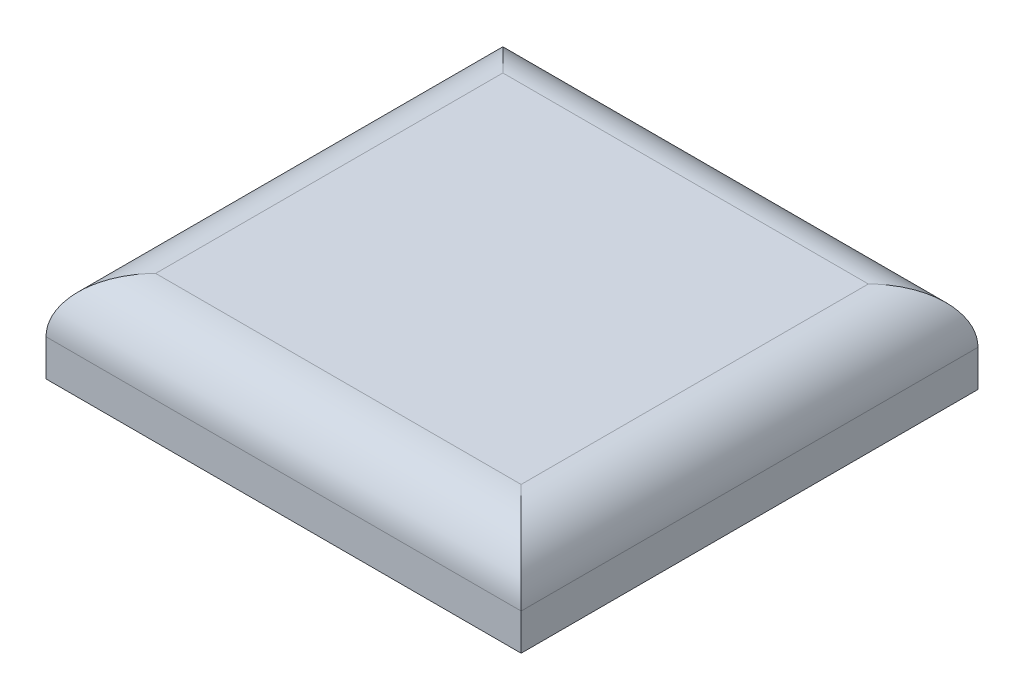
ISO-10303-21;
HEADER;
FILE_DESCRIPTION(('STEP AP214'),'2;1');
FILE_NAME('part.step','',(''),(''),'','','');
FILE_SCHEMA(('AUTOMOTIVE_DESIGN { 1 0 10303 214 1 1 1 1 }'));
ENDSEC;
DATA;
#1=APPLICATION_CONTEXT('core data for automotive mechanical design processes');
#2=APPLICATION_PROTOCOL_DEFINITION('international standard','automotive_design',2000,#1);
#3=PRODUCT_CONTEXT('',#1,'mechanical');
#4=PRODUCT('Part','Part','',(#3));
#5=PRODUCT_RELATED_PRODUCT_CATEGORY('part','',(#4));
#6=PRODUCT_DEFINITION_FORMATION('','',#4);
#7=PRODUCT_DEFINITION_CONTEXT('part definition',#1,'design');
#8=PRODUCT_DEFINITION('design','',#6,#7);
#9=PRODUCT_DEFINITION_SHAPE('','',#8);
#10=(LENGTH_UNIT() NAMED_UNIT(*) SI_UNIT(.MILLI.,.METRE.));
#11=(NAMED_UNIT(*) PLANE_ANGLE_UNIT() SI_UNIT($,.RADIAN.));
#12=(NAMED_UNIT(*) SI_UNIT($,.STERADIAN.) SOLID_ANGLE_UNIT());
#13=UNCERTAINTY_MEASURE_WITH_UNIT(LENGTH_MEASURE(1.E-05),#10,'distance_accuracy_value','');
#14=(GEOMETRIC_REPRESENTATION_CONTEXT(3) GLOBAL_UNCERTAINTY_ASSIGNED_CONTEXT((#13)) GLOBAL_UNIT_ASSIGNED_CONTEXT((#10,
#11,#12)) REPRESENTATION_CONTEXT('',''));
#15=CARTESIAN_POINT('',(0.,0.,0.));
#16=DIRECTION('',(0.,0.,1.));
#17=DIRECTION('',(1.,0.,0.));
#18=AXIS2_PLACEMENT_3D('',#15,#16,#17);
#19=CARTESIAN_POINT('',(766.873880354263,267.2,-662.343378516994));
#20=DIRECTION('',(0.,0.,1.));
#21=DIRECTION('',(1.,0.,0.));
#22=AXIS2_PLACEMENT_3D('',#19,#20,#21);
#23=PLANE('',#22);
#24=DIRECTION('',(0.,-1.,0.));
#25=VECTOR('',#24,1.);
#26=CARTESIAN_POINT('',(-533.126119645738,267.2,-662.343378516994));
#27=LINE('',#26,#25);
#28=CARTESIAN_POINT('',(-533.126119645738,117.2,-662.343378516994));
#29=VERTEX_POINT('',#28);
#30=CARTESIAN_POINT('',(-533.126119645738,17.2,-662.343378516994));
#31=VERTEX_POINT('',#30);
#32=EDGE_CURVE('E201',#29,#31,#27,.T.);
#33=ORIENTED_EDGE('',*,*,#32,.F.);
#34=DIRECTION('',(-1.,0.,0.));
#35=VECTOR('',#34,1.);
#36=CARTESIAN_POINT('',(766.873880354263,117.2,-662.343378516994));
#37=LINE('',#36,#35);
#38=CARTESIAN_POINT('',(766.873880354263,117.2,-662.343378516994));
#39=VERTEX_POINT('',#38);
#40=EDGE_CURVE('E11',#29,#39,#37,.F.);
#41=ORIENTED_EDGE('',*,*,#40,.T.);
#42=DIRECTION('',(0.,-1.,0.));
#43=VECTOR('',#42,1.);
#44=CARTESIAN_POINT('',(766.873880354263,267.2,-662.343378516994));
#45=LINE('',#44,#43);
#46=CARTESIAN_POINT('',(766.873880354263,17.2,-662.343378516994));
#47=VERTEX_POINT('',#46);
#48=EDGE_CURVE('E195',#39,#47,#45,.T.);
#49=ORIENTED_EDGE('',*,*,#48,.T.);
#50=DIRECTION('',(-1.,0.,0.));
#51=VECTOR('',#50,1.);
#52=CARTESIAN_POINT('',(766.873880354263,17.2,-662.343378516994));
#53=LINE('',#52,#51);
#54=EDGE_CURVE('E183',#47,#31,#53,.T.);
#55=ORIENTED_EDGE('',*,*,#54,.T.);
#56=EDGE_LOOP('',(#33,#41,#49,#55));
#57=FACE_BOUND('',#56,.T.);
#58=ADVANCED_FACE('F43',(#57),#23,.F.);
#59=CARTESIAN_POINT('',(-533.126119645738,267.2,-662.343378516994));
#60=DIRECTION('',(1.,0.,0.));
#61=DIRECTION('',(0.,0.,-1.));
#62=AXIS2_PLACEMENT_3D('',#59,#60,#61);
#63=PLANE('',#62);
#64=DIRECTION('',(0.,-1.,0.));
#65=VECTOR('',#64,1.);
#66=CARTESIAN_POINT('',(-533.126119645738,267.2,587.656621483006));
#67=LINE('',#66,#65);
#68=CARTESIAN_POINT('',(-533.126119645738,117.2,587.656621483006));
#69=VERTEX_POINT('',#68);
#70=CARTESIAN_POINT('',(-533.126119645738,17.2,587.656621483006));
#71=VERTEX_POINT('',#70);
#72=EDGE_CURVE('E199',#69,#71,#67,.T.);
#73=ORIENTED_EDGE('',*,*,#72,.F.);
#74=DIRECTION('',(0.,0.,1.));
#75=VECTOR('',#74,1.);
#76=CARTESIAN_POINT('',(-533.126119645738,117.2,-662.343378516994));
#77=LINE('',#76,#75);
#78=EDGE_CURVE('E52',#69,#29,#77,.F.);
#79=ORIENTED_EDGE('',*,*,#78,.T.);
#80=ORIENTED_EDGE('',*,*,#32,.T.);
#81=DIRECTION('',(0.,0.,1.));
#82=VECTOR('',#81,1.);
#83=CARTESIAN_POINT('',(-533.126119645738,17.2,-662.343378516994));
#84=LINE('',#83,#82);
#85=EDGE_CURVE('E186',#31,#71,#84,.T.);
#86=ORIENTED_EDGE('',*,*,#85,.T.);
#87=EDGE_LOOP('',(#73,#79,#80,#86));
#88=FACE_BOUND('',#87,.T.);
#89=ADVANCED_FACE('F263',(#88),#63,.F.);
#90=CARTESIAN_POINT('',(-533.126119645738,267.2,587.656621483006));
#91=DIRECTION('',(0.,0.,-1.));
#92=DIRECTION('',(-1.,0.,0.));
#93=AXIS2_PLACEMENT_3D('',#90,#91,#92);
#94=PLANE('',#93);
#95=DIRECTION('',(0.,-1.,0.));
#96=VECTOR('',#95,1.);
#97=CARTESIAN_POINT('',(766.873880354262,267.2,587.656621483006));
#98=LINE('',#97,#96);
#99=CARTESIAN_POINT('',(766.873880354262,117.2,587.656621483006));
#100=VERTEX_POINT('',#99);
#101=CARTESIAN_POINT('',(766.873880354262,17.2,587.656621483006));
#102=VERTEX_POINT('',#101);
#103=EDGE_CURVE('E197',#100,#102,#98,.T.);
#104=ORIENTED_EDGE('',*,*,#103,.F.);
#105=DIRECTION('',(1.,0.,0.));
#106=VECTOR('',#105,1.);
#107=CARTESIAN_POINT('',(-533.126119645738,117.2,587.656621483006));
#108=LINE('',#107,#106);
#109=EDGE_CURVE('E215',#100,#69,#108,.F.);
#110=ORIENTED_EDGE('',*,*,#109,.T.);
#111=ORIENTED_EDGE('',*,*,#72,.T.);
#112=DIRECTION('',(1.,0.,0.));
#113=VECTOR('',#112,1.);
#114=CARTESIAN_POINT('',(-533.126119645738,17.2,587.656621483006));
#115=LINE('',#114,#113);
#116=EDGE_CURVE('E189',#71,#102,#115,.T.);
#117=ORIENTED_EDGE('',*,*,#116,.T.);
#118=EDGE_LOOP('',(#104,#110,#111,#117));
#119=FACE_BOUND('',#118,.T.);
#120=ADVANCED_FACE('F259',(#119),#94,.F.);
#121=CARTESIAN_POINT('',(766.873880354262,267.2,587.656621483006));
#122=DIRECTION('',(-1.,0.,0.));
#123=DIRECTION('',(0.,0.,1.));
#124=AXIS2_PLACEMENT_3D('',#121,#122,#123);
#125=PLANE('',#124);
#126=ORIENTED_EDGE('',*,*,#48,.F.);
#127=DIRECTION('',(0.,0.,-1.));
#128=VECTOR('',#127,1.);
#129=CARTESIAN_POINT('',(766.873880354262,117.2,587.656621483006));
#130=LINE('',#129,#128);
#131=EDGE_CURVE('E212',#39,#100,#130,.F.);
#132=ORIENTED_EDGE('',*,*,#131,.T.);
#133=ORIENTED_EDGE('',*,*,#103,.T.);
#134=DIRECTION('',(0.,0.,-1.));
#135=VECTOR('',#134,1.);
#136=CARTESIAN_POINT('',(766.873880354262,17.2,587.656621483006));
#137=LINE('',#136,#135);
#138=EDGE_CURVE('E192',#102,#47,#137,.T.);
#139=ORIENTED_EDGE('',*,*,#138,.T.);
#140=EDGE_LOOP('',(#126,#132,#133,#139));
#141=FACE_BOUND('',#140,.T.);
#142=ADVANCED_FACE('F241',(#141),#125,.F.);
#143=CARTESIAN_POINT('',(0.,267.2,0.));
#144=DIRECTION('',(0.,1.,0.));
#145=DIRECTION('',(0.,0.,1.));
#146=AXIS2_PLACEMENT_3D('',#143,#144,#145);
#147=PLANE('',#146);
#148=DIRECTION('',(1.,0.,0.));
#149=VECTOR('',#148,1.);
#150=CARTESIAN_POINT('',(766.873880354262,267.2,437.656621483006));
#151=LINE('',#150,#149);
#152=CARTESIAN_POINT('',(-383.126119645738,267.2,437.656621483006));
#153=VERTEX_POINT('',#152);
#154=CARTESIAN_POINT('',(616.873880354262,267.2,437.656621483006));
#155=VERTEX_POINT('',#154);
#156=EDGE_CURVE('E207',#153,#155,#151,.T.);
#157=ORIENTED_EDGE('',*,*,#156,.T.);
#158=DIRECTION('',(0.,0.,-1.));
#159=VECTOR('',#158,1.);
#160=CARTESIAN_POINT('',(616.873880354263,267.2,-662.343378516994));
#161=LINE('',#160,#159);
#162=CARTESIAN_POINT('',(616.873880354263,267.2,-512.343378516994));
#163=VERTEX_POINT('',#162);
#164=EDGE_CURVE('E209',#155,#163,#161,.T.);
#165=ORIENTED_EDGE('',*,*,#164,.T.);
#166=DIRECTION('',(-1.,0.,0.));
#167=VECTOR('',#166,1.);
#168=CARTESIAN_POINT('',(-533.126119645738,267.2,-512.343378516994));
#169=LINE('',#168,#167);
#170=CARTESIAN_POINT('',(-383.126119645738,267.2,-512.343378516994));
#171=VERTEX_POINT('',#170);
#172=EDGE_CURVE('E203',#163,#171,#169,.T.);
#173=ORIENTED_EDGE('',*,*,#172,.T.);
#174=DIRECTION('',(0.,0.,1.));
#175=VECTOR('',#174,1.);
#176=CARTESIAN_POINT('',(-383.126119645738,267.2,587.656621483006));
#177=LINE('',#176,#175);
#178=EDGE_CURVE('E205',#171,#153,#177,.T.);
#179=ORIENTED_EDGE('',*,*,#178,.T.);
#180=EDGE_LOOP('',(#157,#165,#173,#179));
#181=FACE_BOUND('',#180,.T.);
#182=ADVANCED_FACE('F249',(#181),#147,.T.);
#183=CARTESIAN_POINT('',(0.,17.2,0.));
#184=DIRECTION('',(0.,1.,0.));
#185=DIRECTION('',(0.,0.,1.));
#186=AXIS2_PLACEMENT_3D('',#183,#184,#185);
#187=PLANE('',#186);
#188=DIRECTION('',(0.,0.,-1.));
#189=VECTOR('',#188,1.);
#190=CARTESIAN_POINT('',(756.873880354262,17.2,587.656621483006));
#191=LINE('',#190,#189);
#192=CARTESIAN_POINT('',(756.873880354262,17.2,577.656621483006));
#193=VERTEX_POINT('',#192);
#194=CARTESIAN_POINT('',(756.873880354263,17.2,-652.343378516994));
#195=VERTEX_POINT('',#194);
#196=EDGE_CURVE('E156',#193,#195,#191,.T.);
#197=ORIENTED_EDGE('',*,*,#196,.T.);
#198=DIRECTION('',(-1.,0.,0.));
#199=VECTOR('',#198,1.);
#200=CARTESIAN_POINT('',(766.873880354263,17.2,-652.343378516994));
#201=LINE('',#200,#199);
#202=CARTESIAN_POINT('',(-523.126119645738,17.2,-652.343378516994));
#203=VERTEX_POINT('',#202);
#204=EDGE_CURVE('E151',#195,#203,#201,.T.);
#205=ORIENTED_EDGE('',*,*,#204,.T.);
#206=DIRECTION('',(0.,0.,1.));
#207=VECTOR('',#206,1.);
#208=CARTESIAN_POINT('',(-523.126119645738,17.2,-662.343378516994));
#209=LINE('',#208,#207);
#210=CARTESIAN_POINT('',(-523.126119645738,17.2,577.656621483006));
#211=VERTEX_POINT('',#210);
#212=EDGE_CURVE('E177',#203,#211,#209,.T.);
#213=ORIENTED_EDGE('',*,*,#212,.T.);
#214=DIRECTION('',(1.,0.,0.));
#215=VECTOR('',#214,1.);
#216=CARTESIAN_POINT('',(-533.126119645738,17.2,577.656621483006));
#217=LINE('',#216,#215);
#218=EDGE_CURVE('E60',#211,#193,#217,.T.);
#219=ORIENTED_EDGE('',*,*,#218,.T.);
#220=EDGE_LOOP('',(#197,#205,#213,#219));
#221=FACE_BOUND('',#220,.T.);
#222=ORIENTED_EDGE('',*,*,#54,.F.);
#223=ORIENTED_EDGE('',*,*,#138,.F.);
#224=ORIENTED_EDGE('',*,*,#116,.F.);
#225=ORIENTED_EDGE('',*,*,#85,.F.);
#226=EDGE_LOOP('',(#222,#223,#224,#225));
#227=FACE_BOUND('',#226,.T.);
#228=ADVANCED_FACE('F251',(#221,#227),#187,.F.);
#229=CARTESIAN_POINT('',(-383.126119645738,117.2,0.));
#230=DIRECTION('',(0.,0.,-1.));
#231=DIRECTION('',(-1.,0.,0.));
#232=AXIS2_PLACEMENT_3D('',#229,#230,#231);
#233=CYLINDRICAL_SURFACE('',#232,150.);
#234=CARTESIAN_POINT('',(-383.126119645738,117.2,-512.343378516994));
#235=DIRECTION('',(0.707106781186547,0.,-0.707106781186548));
#236=DIRECTION('',(0.707106781186547,0.,0.707106781186547));
#237=AXIS2_PLACEMENT_3D('',#234,#235,#236);
#238=ELLIPSE('',#237,212.132034355964,150.);
#239=EDGE_CURVE('E220',#29,#171,#238,.T.);
#240=ORIENTED_EDGE('',*,*,#239,.F.);
#241=ORIENTED_EDGE('',*,*,#78,.F.);
#242=CARTESIAN_POINT('',(-383.126119645738,117.2,437.656621483006));
#243=DIRECTION('',(-0.707106781186547,0.,-0.707106781186547));
#244=DIRECTION('',(0.707106781186547,0.,-0.707106781186548));
#245=AXIS2_PLACEMENT_3D('',#242,#243,#244);
#246=ELLIPSE('',#245,212.132034355964,150.);
#247=EDGE_CURVE('E47',#153,#69,#246,.F.);
#248=ORIENTED_EDGE('',*,*,#247,.F.);
#249=ORIENTED_EDGE('',*,*,#178,.F.);
#250=EDGE_LOOP('',(#240,#241,#248,#249));
#251=FACE_BOUND('',#250,.T.);
#252=ADVANCED_FACE('F45',(#251),#233,.T.);
#253=CARTESIAN_POINT('',(0.,117.2,437.656621483006));
#254=DIRECTION('',(-1.,0.,0.));
#255=DIRECTION('',(0.,0.,1.));
#256=AXIS2_PLACEMENT_3D('',#253,#254,#255);
#257=CYLINDRICAL_SURFACE('',#256,150.);
#258=ORIENTED_EDGE('',*,*,#247,.T.);
#259=ORIENTED_EDGE('',*,*,#109,.F.);
#260=CARTESIAN_POINT('',(616.873880354262,117.2,437.656621483006));
#261=DIRECTION('',(-0.707106781186547,0.,0.707106781186547));
#262=DIRECTION('',(-0.707106781186547,0.,-0.707106781186548));
#263=AXIS2_PLACEMENT_3D('',#260,#261,#262);
#264=ELLIPSE('',#263,212.132034355964,150.);
#265=EDGE_CURVE('E219',#155,#100,#264,.F.);
#266=ORIENTED_EDGE('',*,*,#265,.F.);
#267=ORIENTED_EDGE('',*,*,#156,.F.);
#268=EDGE_LOOP('',(#258,#259,#266,#267));
#269=FACE_BOUND('',#268,.T.);
#270=ADVANCED_FACE('F231',(#269),#257,.T.);
#271=CARTESIAN_POINT('',(0.,117.2,-512.343378516994));
#272=DIRECTION('',(1.,0.,0.));
#273=DIRECTION('',(0.,0.,-1.));
#274=AXIS2_PLACEMENT_3D('',#271,#272,#273);
#275=CYLINDRICAL_SURFACE('',#274,150.);
#276=ORIENTED_EDGE('',*,*,#239,.T.);
#277=ORIENTED_EDGE('',*,*,#172,.F.);
#278=CARTESIAN_POINT('',(616.873880354262,117.2,-512.343378516994));
#279=DIRECTION('',(0.707106781186547,0.,0.707106781186548));
#280=DIRECTION('',(0.707106781186547,0.,-0.707106781186547));
#281=AXIS2_PLACEMENT_3D('',#278,#279,#280);
#282=ELLIPSE('',#281,212.132034355964,150.);
#283=EDGE_CURVE('E143',#39,#163,#282,.T.);
#284=ORIENTED_EDGE('',*,*,#283,.F.);
#285=ORIENTED_EDGE('',*,*,#40,.F.);
#286=EDGE_LOOP('',(#276,#277,#284,#285));
#287=FACE_BOUND('',#286,.T.);
#288=ADVANCED_FACE('F236',(#287),#275,.T.);
#289=CARTESIAN_POINT('',(616.873880354262,117.2,0.));
#290=DIRECTION('',(0.,0.,1.));
#291=DIRECTION('',(1.,0.,0.));
#292=AXIS2_PLACEMENT_3D('',#289,#290,#291);
#293=CYLINDRICAL_SURFACE('',#292,150.);
#294=ORIENTED_EDGE('',*,*,#265,.T.);
#295=ORIENTED_EDGE('',*,*,#131,.F.);
#296=ORIENTED_EDGE('',*,*,#283,.T.);
#297=ORIENTED_EDGE('',*,*,#164,.F.);
#298=EDGE_LOOP('',(#294,#295,#296,#297));
#299=FACE_BOUND('',#298,.T.);
#300=ADVANCED_FACE('F246',(#299),#293,.T.);
#301=CARTESIAN_POINT('',(766.873880354263,267.2,-652.343378516994));
#302=DIRECTION('',(0.,0.,1.));
#303=DIRECTION('',(1.,0.,0.));
#304=AXIS2_PLACEMENT_3D('',#301,#302,#303);
#305=PLANE('',#304);
#306=DIRECTION('',(0.,-1.,0.));
#307=VECTOR('',#306,1.);
#308=CARTESIAN_POINT('',(-523.126119645738,267.2,-652.343378516994));
#309=LINE('',#308,#307);
#310=CARTESIAN_POINT('',(-523.126119645738,117.2,-652.343378516994));
#311=VERTEX_POINT('',#310);
#312=EDGE_CURVE('E490',#311,#203,#309,.T.);
#313=ORIENTED_EDGE('',*,*,#312,.T.);
#314=ORIENTED_EDGE('',*,*,#204,.F.);
#315=DIRECTION('',(0.,-1.,0.));
#316=VECTOR('',#315,1.);
#317=CARTESIAN_POINT('',(756.873880354263,267.2,-652.343378516994));
#318=LINE('',#317,#316);
#319=CARTESIAN_POINT('',(756.873880354262,117.2,-652.343378516994));
#320=VERTEX_POINT('',#319);
#321=EDGE_CURVE('E147',#320,#195,#318,.T.);
#322=ORIENTED_EDGE('',*,*,#321,.F.);
#323=DIRECTION('',(1.,0.,0.));
#324=VECTOR('',#323,1.);
#325=CARTESIAN_POINT('',(766.873880354263,117.2,-652.343378516994));
#326=LINE('',#325,#324);
#327=EDGE_CURVE('E134',#311,#320,#326,.T.);
#328=ORIENTED_EDGE('',*,*,#327,.F.);
#329=EDGE_LOOP('',(#313,#314,#322,#328));
#330=FACE_BOUND('',#329,.T.);
#331=ADVANCED_FACE('F149',(#330),#305,.T.);
#332=CARTESIAN_POINT('',(-523.126119645738,267.2,-662.343378516994));
#333=DIRECTION('',(1.,0.,0.));
#334=DIRECTION('',(0.,0.,-1.));
#335=AXIS2_PLACEMENT_3D('',#332,#333,#334);
#336=PLANE('',#335);
#337=DIRECTION('',(0.,-1.,0.));
#338=VECTOR('',#337,1.);
#339=CARTESIAN_POINT('',(-523.126119645738,267.2,577.656621483006));
#340=LINE('',#339,#338);
#341=CARTESIAN_POINT('',(-523.126119645738,117.2,577.656621483006));
#342=VERTEX_POINT('',#341);
#343=EDGE_CURVE('E491',#342,#211,#340,.T.);
#344=ORIENTED_EDGE('',*,*,#343,.T.);
#345=ORIENTED_EDGE('',*,*,#212,.F.);
#346=ORIENTED_EDGE('',*,*,#312,.F.);
#347=DIRECTION('',(0.,0.,-1.));
#348=VECTOR('',#347,1.);
#349=CARTESIAN_POINT('',(-523.126119645738,117.2,-662.343378516994));
#350=LINE('',#349,#348);
#351=EDGE_CURVE('E144',#342,#311,#350,.T.);
#352=ORIENTED_EDGE('',*,*,#351,.F.);
#353=EDGE_LOOP('',(#344,#345,#346,#352));
#354=FACE_BOUND('',#353,.T.);
#355=ADVANCED_FACE('F302',(#354),#336,.T.);
#356=CARTESIAN_POINT('',(-533.126119645738,267.2,577.656621483006));
#357=DIRECTION('',(0.,0.,-1.));
#358=DIRECTION('',(-1.,0.,0.));
#359=AXIS2_PLACEMENT_3D('',#356,#357,#358);
#360=PLANE('',#359);
#361=DIRECTION('',(0.,-1.,0.));
#362=VECTOR('',#361,1.);
#363=CARTESIAN_POINT('',(756.873880354262,267.2,577.656621483006));
#364=LINE('',#363,#362);
#365=CARTESIAN_POINT('',(756.873880354262,117.2,577.656621483006));
#366=VERTEX_POINT('',#365);
#367=EDGE_CURVE('E155',#366,#193,#364,.T.);
#368=ORIENTED_EDGE('',*,*,#367,.T.);
#369=ORIENTED_EDGE('',*,*,#218,.F.);
#370=ORIENTED_EDGE('',*,*,#343,.F.);
#371=DIRECTION('',(-1.,0.,0.));
#372=VECTOR('',#371,1.);
#373=CARTESIAN_POINT('',(-533.126119645738,117.2,577.656621483006));
#374=LINE('',#373,#372);
#375=EDGE_CURVE('E164',#366,#342,#374,.T.);
#376=ORIENTED_EDGE('',*,*,#375,.F.);
#377=EDGE_LOOP('',(#368,#369,#370,#376));
#378=FACE_BOUND('',#377,.T.);
#379=ADVANCED_FACE('F312',(#378),#360,.T.);
#380=CARTESIAN_POINT('',(756.873880354262,267.2,587.656621483006));
#381=DIRECTION('',(-1.,0.,0.));
#382=DIRECTION('',(0.,0.,1.));
#383=AXIS2_PLACEMENT_3D('',#380,#381,#382);
#384=PLANE('',#383);
#385=ORIENTED_EDGE('',*,*,#321,.T.);
#386=ORIENTED_EDGE('',*,*,#196,.F.);
#387=ORIENTED_EDGE('',*,*,#367,.F.);
#388=DIRECTION('',(0.,0.,1.));
#389=VECTOR('',#388,1.);
#390=CARTESIAN_POINT('',(756.873880354262,117.2,587.656621483006));
#391=LINE('',#390,#389);
#392=EDGE_CURVE('E160',#320,#366,#391,.T.);
#393=ORIENTED_EDGE('',*,*,#392,.F.);
#394=EDGE_LOOP('',(#385,#386,#387,#393));
#395=FACE_BOUND('',#394,.T.);
#396=ADVANCED_FACE('F161',(#395),#384,.T.);
#397=CARTESIAN_POINT('',(0.,257.2,0.));
#398=DIRECTION('',(0.,1.,0.));
#399=DIRECTION('',(0.,0.,1.));
#400=AXIS2_PLACEMENT_3D('',#397,#398,#399);
#401=PLANE('',#400);
#402=DIRECTION('',(1.,0.,0.));
#403=VECTOR('',#402,1.);
#404=CARTESIAN_POINT('',(0.,257.2,437.656621483006));
#405=LINE('',#404,#403);
#406=CARTESIAN_POINT('',(-383.126119645738,257.2,437.656621483006));
#407=VERTEX_POINT('',#406);
#408=CARTESIAN_POINT('',(616.873880354262,257.2,437.656621483006));
#409=VERTEX_POINT('',#408);
#410=EDGE_CURVE('E481',#407,#409,#405,.T.);
#411=ORIENTED_EDGE('',*,*,#410,.F.);
#412=DIRECTION('',(0.,0.,1.));
#413=VECTOR('',#412,1.);
#414=CARTESIAN_POINT('',(-383.126119645738,257.2,0.));
#415=LINE('',#414,#413);
#416=CARTESIAN_POINT('',(-383.126119645738,257.2,-512.343378516994));
#417=VERTEX_POINT('',#416);
#418=EDGE_CURVE('E485',#417,#407,#415,.T.);
#419=ORIENTED_EDGE('',*,*,#418,.F.);
#420=DIRECTION('',(1.,0.,0.));
#421=VECTOR('',#420,1.);
#422=CARTESIAN_POINT('',(0.,257.2,-512.343378516994));
#423=LINE('',#422,#421);
#424=CARTESIAN_POINT('',(616.873880354263,257.2,-512.343378516994));
#425=VERTEX_POINT('',#424);
#426=EDGE_CURVE('E488',#425,#417,#423,.F.);
#427=ORIENTED_EDGE('',*,*,#426,.F.);
#428=DIRECTION('',(0.,0.,1.));
#429=VECTOR('',#428,1.);
#430=CARTESIAN_POINT('',(616.873880354262,257.2,0.));
#431=LINE('',#430,#429);
#432=EDGE_CURVE('E165',#409,#425,#431,.F.);
#433=ORIENTED_EDGE('',*,*,#432,.F.);
#434=EDGE_LOOP('',(#411,#419,#427,#433));
#435=FACE_BOUND('',#434,.T.);
#436=ADVANCED_FACE('F332',(#435),#401,.F.);
#437=CARTESIAN_POINT('',(-383.126119645738,117.2,0.));
#438=DIRECTION('',(0.,0.,-1.));
#439=DIRECTION('',(-1.,0.,0.));
#440=AXIS2_PLACEMENT_3D('',#437,#438,#439);
#441=CYLINDRICAL_SURFACE('',#440,140.);
#442=CARTESIAN_POINT('',(-383.126119645738,117.2,-512.343378516994));
#443=DIRECTION('',(0.707106781186547,0.,-0.707106781186548));
#444=DIRECTION('',(0.707106781186547,0.,0.707106781186547));
#445=AXIS2_PLACEMENT_3D('',#442,#443,#444);
#446=ELLIPSE('',#445,197.989898732233,140.);
#447=EDGE_CURVE('E141',#311,#417,#446,.T.);
#448=ORIENTED_EDGE('',*,*,#447,.T.);
#449=ORIENTED_EDGE('',*,*,#418,.T.);
#450=CARTESIAN_POINT('',(-383.126119645738,117.2,437.656621483006));
#451=DIRECTION('',(-0.707106781186547,0.,-0.707106781186547));
#452=DIRECTION('',(-0.707106781186547,0.,0.707106781186548));
#453=AXIS2_PLACEMENT_3D('',#450,#451,#452);
#454=ELLIPSE('',#453,197.989898732233,140.);
#455=EDGE_CURVE('E178',#407,#342,#454,.F.);
#456=ORIENTED_EDGE('',*,*,#455,.T.);
#457=ORIENTED_EDGE('',*,*,#351,.T.);
#458=EDGE_LOOP('',(#448,#449,#456,#457));
#459=FACE_BOUND('',#458,.T.);
#460=ADVANCED_FACE('F342',(#459),#441,.F.);
#461=CARTESIAN_POINT('',(0.,117.2,437.656621483006));
#462=DIRECTION('',(-1.,0.,0.));
#463=DIRECTION('',(0.,0.,1.));
#464=AXIS2_PLACEMENT_3D('',#461,#462,#463);
#465=CYLINDRICAL_SURFACE('',#464,140.);
#466=ORIENTED_EDGE('',*,*,#455,.F.);
#467=ORIENTED_EDGE('',*,*,#410,.T.);
#468=CARTESIAN_POINT('',(616.873880354262,117.2,437.656621483006));
#469=DIRECTION('',(-0.707106781186547,0.,0.707106781186547));
#470=DIRECTION('',(0.707106781186547,0.,0.707106781186548));
#471=AXIS2_PLACEMENT_3D('',#468,#469,#470);
#472=ELLIPSE('',#471,197.989898732233,140.);
#473=EDGE_CURVE('E170',#409,#366,#472,.F.);
#474=ORIENTED_EDGE('',*,*,#473,.T.);
#475=ORIENTED_EDGE('',*,*,#375,.T.);
#476=EDGE_LOOP('',(#466,#467,#474,#475));
#477=FACE_BOUND('',#476,.T.);
#478=ADVANCED_FACE('F353',(#477),#465,.F.);
#479=CARTESIAN_POINT('',(0.,117.2,-512.343378516994));
#480=DIRECTION('',(1.,0.,0.));
#481=DIRECTION('',(0.,0.,-1.));
#482=AXIS2_PLACEMENT_3D('',#479,#480,#481);
#483=CYLINDRICAL_SURFACE('',#482,140.);
#484=ORIENTED_EDGE('',*,*,#447,.F.);
#485=ORIENTED_EDGE('',*,*,#327,.T.);
#486=CARTESIAN_POINT('',(616.873880354262,117.2,-512.343378516994));
#487=DIRECTION('',(0.707106781186547,0.,0.707106781186548));
#488=DIRECTION('',(-0.707106781186547,0.,0.707106781186547));
#489=AXIS2_PLACEMENT_3D('',#486,#487,#488);
#490=ELLIPSE('',#489,197.989898732233,140.);
#491=EDGE_CURVE('E138',#320,#425,#490,.T.);
#492=ORIENTED_EDGE('',*,*,#491,.T.);
#493=ORIENTED_EDGE('',*,*,#426,.T.);
#494=EDGE_LOOP('',(#484,#485,#492,#493));
#495=FACE_BOUND('',#494,.T.);
#496=ADVANCED_FACE('F136',(#495),#483,.F.);
#497=CARTESIAN_POINT('',(616.873880354262,117.2,0.));
#498=DIRECTION('',(0.,0.,1.));
#499=DIRECTION('',(1.,0.,0.));
#500=AXIS2_PLACEMENT_3D('',#497,#498,#499);
#501=CYLINDRICAL_SURFACE('',#500,140.);
#502=ORIENTED_EDGE('',*,*,#473,.F.);
#503=ORIENTED_EDGE('',*,*,#432,.T.);
#504=ORIENTED_EDGE('',*,*,#491,.F.);
#505=ORIENTED_EDGE('',*,*,#392,.T.);
#506=EDGE_LOOP('',(#502,#503,#504,#505));
#507=FACE_BOUND('',#506,.T.);
#508=ADVANCED_FACE('F168',(#507),#501,.F.);
#509=CLOSED_SHELL('',(#58,#89,#120,#142,#182,#228,#252,#270,#288,#300,#331,#355,#379,#396,#436,
#460,#478,#496,#508));
#510=MANIFOLD_SOLID_BREP('B2',#509);
#511=ADVANCED_BREP_SHAPE_REPRESENTATION('',(#18,#510),#14);
#512=SHAPE_DEFINITION_REPRESENTATION(#9,#511);
ENDSEC;
END-ISO-10303-21;
